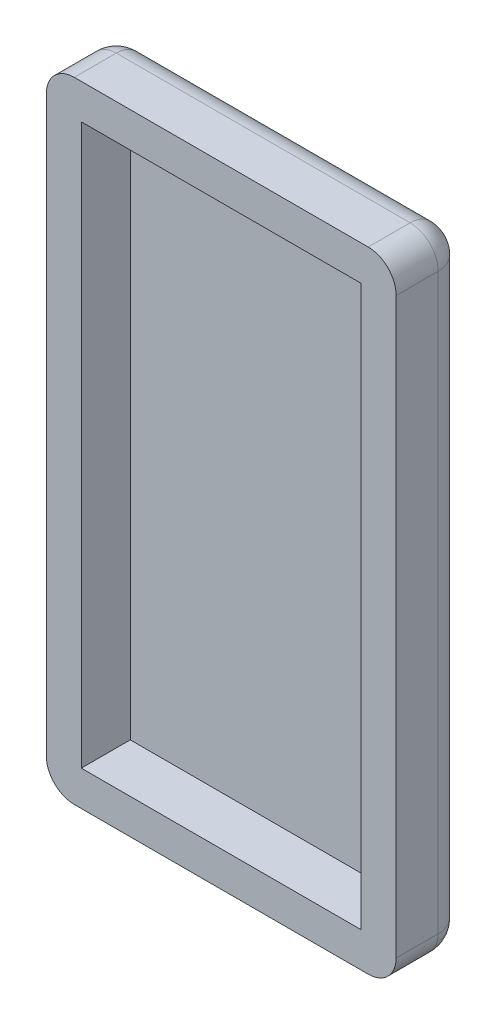
ISO-10303-21;
HEADER;
FILE_DESCRIPTION(('STEP AP214'),'2;1');
FILE_NAME('part.step','',(''),(''),'','','');
FILE_SCHEMA(('AUTOMOTIVE_DESIGN { 1 0 10303 214 1 1 1 1 }'));
ENDSEC;
DATA;
#1=APPLICATION_CONTEXT('core data for automotive mechanical design processes');
#2=APPLICATION_PROTOCOL_DEFINITION('international standard','automotive_design',2000,#1);
#3=PRODUCT_CONTEXT('',#1,'mechanical');
#4=PRODUCT('Part','Part','',(#3));
#5=PRODUCT_RELATED_PRODUCT_CATEGORY('part','',(#4));
#6=PRODUCT_DEFINITION_FORMATION('','',#4);
#7=PRODUCT_DEFINITION_CONTEXT('part definition',#1,'design');
#8=PRODUCT_DEFINITION('design','',#6,#7);
#9=PRODUCT_DEFINITION_SHAPE('','',#8);
#10=(LENGTH_UNIT() NAMED_UNIT(*) SI_UNIT(.MILLI.,.METRE.));
#11=(NAMED_UNIT(*) PLANE_ANGLE_UNIT() SI_UNIT($,.RADIAN.));
#12=(NAMED_UNIT(*) SI_UNIT($,.STERADIAN.) SOLID_ANGLE_UNIT());
#13=UNCERTAINTY_MEASURE_WITH_UNIT(LENGTH_MEASURE(1.E-05),#10,'distance_accuracy_value','');
#14=(GEOMETRIC_REPRESENTATION_CONTEXT(3) GLOBAL_UNCERTAINTY_ASSIGNED_CONTEXT((#13)) GLOBAL_UNIT_ASSIGNED_CONTEXT((#10,
#11,#12)) REPRESENTATION_CONTEXT('',''));
#15=CARTESIAN_POINT('',(0.,0.,0.));
#16=DIRECTION('',(0.,0.,1.));
#17=DIRECTION('',(1.,0.,0.));
#18=AXIS2_PLACEMENT_3D('',#15,#16,#17);
#19=CARTESIAN_POINT('',(-13.1619937694704,5.79439252336449,0.));
#20=DIRECTION('',(-1.,0.,0.));
#21=DIRECTION('',(0.,-1.,0.));
#22=AXIS2_PLACEMENT_3D('',#19,#20,#21);
#23=PLANE('',#22);
#24=DIRECTION('',(0.,-1.,0.));
#25=VECTOR('',#24,1.);
#26=CARTESIAN_POINT('',(-13.1619937694704,5.79439252336449,5.));
#27=LINE('',#26,#25);
#28=CARTESIAN_POINT('',(-13.1619937694704,3.79439252336449,5.));
#29=VERTEX_POINT('',#28);
#30=CARTESIAN_POINT('',(-13.1619937694704,-37.2056074766355,5.));
#31=VERTEX_POINT('',#30);
#32=EDGE_CURVE('E173',#29,#31,#27,.T.);
#33=ORIENTED_EDGE('',*,*,#32,.F.);
#34=DIRECTION('',(0.,0.,1.));
#35=VECTOR('',#34,1.);
#36=CARTESIAN_POINT('',(-13.1619937694704,3.79439252336449,0.));
#37=LINE('',#36,#35);
#38=CARTESIAN_POINT('',(-13.1619937694704,3.79439252336449,2.));
#39=VERTEX_POINT('',#38);
#40=EDGE_CURVE('E222',#29,#39,#37,.F.);
#41=ORIENTED_EDGE('',*,*,#40,.T.);
#42=DIRECTION('',(0.,-1.,0.));
#43=VECTOR('',#42,1.);
#44=CARTESIAN_POINT('',(-13.1619937694704,-39.2056074766355,2.));
#45=LINE('',#44,#43);
#46=CARTESIAN_POINT('',(-13.1619937694704,-37.2056074766355,2.));
#47=VERTEX_POINT('',#46);
#48=EDGE_CURVE('E218',#39,#47,#45,.T.);
#49=ORIENTED_EDGE('',*,*,#48,.T.);
#50=DIRECTION('',(0.,0.,1.));
#51=VECTOR('',#50,1.);
#52=CARTESIAN_POINT('',(-13.1619937694704,-37.2056074766355,0.));
#53=LINE('',#52,#51);
#54=EDGE_CURVE('E220',#47,#31,#53,.T.);
#55=ORIENTED_EDGE('',*,*,#54,.T.);
#56=EDGE_LOOP('',(#33,#41,#49,#55));
#57=FACE_BOUND('',#56,.T.);
#58=ADVANCED_FACE('F33',(#57),#23,.T.);
#59=CARTESIAN_POINT('',(11.8380062305296,5.79439252336449,0.));
#60=DIRECTION('',(0.,1.,0.));
#61=DIRECTION('',(0.,0.,1.));
#62=AXIS2_PLACEMENT_3D('',#59,#60,#61);
#63=PLANE('',#62);
#64=DIRECTION('',(-1.,0.,0.));
#65=VECTOR('',#64,1.);
#66=CARTESIAN_POINT('',(11.8380062305296,5.79439252336449,5.));
#67=LINE('',#66,#65);
#68=CARTESIAN_POINT('',(9.8380062305296,5.79439252336449,5.));
#69=VERTEX_POINT('',#68);
#70=CARTESIAN_POINT('',(-11.1619937694704,5.79439252336449,5.));
#71=VERTEX_POINT('',#70);
#72=EDGE_CURVE('E185',#69,#71,#67,.T.);
#73=ORIENTED_EDGE('',*,*,#72,.F.);
#74=DIRECTION('',(0.,0.,1.));
#75=VECTOR('',#74,1.);
#76=CARTESIAN_POINT('',(9.8380062305296,5.79439252336449,0.));
#77=LINE('',#76,#75);
#78=CARTESIAN_POINT('',(9.8380062305296,5.79439252336449,2.));
#79=VERTEX_POINT('',#78);
#80=EDGE_CURVE('E207',#69,#79,#77,.F.);
#81=ORIENTED_EDGE('',*,*,#80,.T.);
#82=DIRECTION('',(-1.,0.,0.));
#83=VECTOR('',#82,1.);
#84=CARTESIAN_POINT('',(-13.1619937694704,5.79439252336449,2.));
#85=LINE('',#84,#83);
#86=CARTESIAN_POINT('',(-11.1619937694704,5.79439252336449,2.));
#87=VERTEX_POINT('',#86);
#88=EDGE_CURVE('E205',#79,#87,#85,.T.);
#89=ORIENTED_EDGE('',*,*,#88,.T.);
#90=DIRECTION('',(0.,0.,1.));
#91=VECTOR('',#90,1.);
#92=CARTESIAN_POINT('',(-11.1619937694704,5.79439252336449,0.));
#93=LINE('',#92,#91);
#94=EDGE_CURVE('E203',#87,#71,#93,.T.);
#95=ORIENTED_EDGE('',*,*,#94,.T.);
#96=EDGE_LOOP('',(#73,#81,#89,#95));
#97=FACE_BOUND('',#96,.T.);
#98=ADVANCED_FACE('F315',(#97),#63,.T.);
#99=CARTESIAN_POINT('',(11.8380062305296,-39.2056074766355,0.));
#100=DIRECTION('',(1.,0.,0.));
#101=DIRECTION('',(0.,1.,0.));
#102=AXIS2_PLACEMENT_3D('',#99,#100,#101);
#103=PLANE('',#102);
#104=DIRECTION('',(0.,1.,0.));
#105=VECTOR('',#104,1.);
#106=CARTESIAN_POINT('',(11.8380062305296,5.79439252336449,2.));
#107=LINE('',#106,#105);
#108=CARTESIAN_POINT('',(11.8380062305296,-37.2056074766355,2.));
#109=VERTEX_POINT('',#108);
#110=CARTESIAN_POINT('',(11.8380062305296,3.79439252336449,2.));
#111=VERTEX_POINT('',#110);
#112=EDGE_CURVE('E190',#109,#111,#107,.T.);
#113=ORIENTED_EDGE('',*,*,#112,.T.);
#114=DIRECTION('',(0.,0.,1.));
#115=VECTOR('',#114,1.);
#116=CARTESIAN_POINT('',(11.8380062305296,3.79439252336449,0.));
#117=LINE('',#116,#115);
#118=CARTESIAN_POINT('',(11.8380062305296,3.79439252336448,5.));
#119=VERTEX_POINT('',#118);
#120=EDGE_CURVE('E192',#111,#119,#117,.T.);
#121=ORIENTED_EDGE('',*,*,#120,.T.);
#122=DIRECTION('',(0.,1.,0.));
#123=VECTOR('',#122,1.);
#124=CARTESIAN_POINT('',(11.8380062305296,-39.2056074766355,5.));
#125=LINE('',#124,#123);
#126=CARTESIAN_POINT('',(11.8380062305296,-37.2056074766355,5.));
#127=VERTEX_POINT('',#126);
#128=EDGE_CURVE('E182',#127,#119,#125,.T.);
#129=ORIENTED_EDGE('',*,*,#128,.F.);
#130=DIRECTION('',(0.,0.,1.));
#131=VECTOR('',#130,1.);
#132=CARTESIAN_POINT('',(11.8380062305296,-37.2056074766355,0.));
#133=LINE('',#132,#131);
#134=EDGE_CURVE('E188',#127,#109,#133,.F.);
#135=ORIENTED_EDGE('',*,*,#134,.T.);
#136=EDGE_LOOP('',(#113,#121,#129,#135));
#137=FACE_BOUND('',#136,.T.);
#138=ADVANCED_FACE('F307',(#137),#103,.T.);
#139=CARTESIAN_POINT('',(-13.1619937694704,-39.2056074766355,0.));
#140=DIRECTION('',(0.,-1.,0.));
#141=DIRECTION('',(0.,0.,-1.));
#142=AXIS2_PLACEMENT_3D('',#139,#140,#141);
#143=PLANE('',#142);
#144=DIRECTION('',(1.,0.,0.));
#145=VECTOR('',#144,1.);
#146=CARTESIAN_POINT('',(-13.1619937694704,-39.2056074766355,5.));
#147=LINE('',#146,#145);
#148=CARTESIAN_POINT('',(-11.1619937694704,-39.2056074766355,5.));
#149=VERTEX_POINT('',#148);
#150=CARTESIAN_POINT('',(9.83800623052961,-39.2056074766355,5.));
#151=VERTEX_POINT('',#150);
#152=EDGE_CURVE('E179',#149,#151,#147,.T.);
#153=ORIENTED_EDGE('',*,*,#152,.F.);
#154=DIRECTION('',(0.,0.,1.));
#155=VECTOR('',#154,1.);
#156=CARTESIAN_POINT('',(-11.1619937694704,-39.2056074766355,0.));
#157=LINE('',#156,#155);
#158=CARTESIAN_POINT('',(-11.1619937694704,-39.2056074766355,2.));
#159=VERTEX_POINT('',#158);
#160=EDGE_CURVE('E11',#149,#159,#157,.F.);
#161=ORIENTED_EDGE('',*,*,#160,.T.);
#162=DIRECTION('',(1.,0.,0.));
#163=VECTOR('',#162,1.);
#164=CARTESIAN_POINT('',(11.8380062305296,-39.2056074766355,2.));
#165=LINE('',#164,#163);
#166=CARTESIAN_POINT('',(9.83800623052961,-39.2056074766355,2.));
#167=VERTEX_POINT('',#166);
#168=EDGE_CURVE('E49',#159,#167,#165,.T.);
#169=ORIENTED_EDGE('',*,*,#168,.T.);
#170=DIRECTION('',(0.,0.,1.));
#171=VECTOR('',#170,1.);
#172=CARTESIAN_POINT('',(9.83800623052961,-39.2056074766355,0.));
#173=LINE('',#172,#171);
#174=EDGE_CURVE('E42',#167,#151,#173,.T.);
#175=ORIENTED_EDGE('',*,*,#174,.T.);
#176=EDGE_LOOP('',(#153,#161,#169,#175));
#177=FACE_BOUND('',#176,.T.);
#178=ADVANCED_FACE('F304',(#177),#143,.T.);
#179=CARTESIAN_POINT('',(0.,0.,0.));
#180=DIRECTION('',(0.,0.,1.));
#181=DIRECTION('',(1.,0.,0.));
#182=AXIS2_PLACEMENT_3D('',#179,#180,#181);
#183=PLANE('',#182);
#184=DIRECTION('',(0.,-1.,0.));
#185=VECTOR('',#184,1.);
#186=CARTESIAN_POINT('',(-11.1619937694704,5.79439252336449,0.));
#187=LINE('',#186,#185);
#188=CARTESIAN_POINT('',(-11.1619937694704,-37.2056074766355,0.));
#189=VERTEX_POINT('',#188);
#190=CARTESIAN_POINT('',(-11.1619937694704,3.79439252336449,0.));
#191=VERTEX_POINT('',#190);
#192=EDGE_CURVE('E211',#189,#191,#187,.F.);
#193=ORIENTED_EDGE('',*,*,#192,.T.);
#194=DIRECTION('',(-1.,0.,0.));
#195=VECTOR('',#194,1.);
#196=CARTESIAN_POINT('',(11.8380062305296,3.79439252336449,0.));
#197=LINE('',#196,#195);
#198=CARTESIAN_POINT('',(9.8380062305296,3.79439252336449,0.));
#199=VERTEX_POINT('',#198);
#200=EDGE_CURVE('E215',#191,#199,#197,.F.);
#201=ORIENTED_EDGE('',*,*,#200,.T.);
#202=DIRECTION('',(0.,1.,0.));
#203=VECTOR('',#202,1.);
#204=CARTESIAN_POINT('',(9.83800623052961,-39.2056074766355,0.));
#205=LINE('',#204,#203);
#206=CARTESIAN_POINT('',(9.83800623052961,-37.2056074766355,0.));
#207=VERTEX_POINT('',#206);
#208=EDGE_CURVE('E213',#199,#207,#205,.F.);
#209=ORIENTED_EDGE('',*,*,#208,.T.);
#210=DIRECTION('',(1.,0.,0.));
#211=VECTOR('',#210,1.);
#212=CARTESIAN_POINT('',(-13.1619937694704,-37.2056074766355,0.));
#213=LINE('',#212,#211);
#214=EDGE_CURVE('E209',#207,#189,#213,.F.);
#215=ORIENTED_EDGE('',*,*,#214,.T.);
#216=EDGE_LOOP('',(#193,#201,#209,#215));
#217=FACE_BOUND('',#216,.T.);
#218=ADVANCED_FACE('F290',(#217),#183,.F.);
#219=CARTESIAN_POINT('',(0.,0.,5.));
#220=DIRECTION('',(0.,0.,1.));
#221=DIRECTION('',(1.,0.,0.));
#222=AXIS2_PLACEMENT_3D('',#219,#220,#221);
#223=PLANE('',#222);
#224=DIRECTION('',(0.,1.,0.));
#225=VECTOR('',#224,1.);
#226=CARTESIAN_POINT('',(9.3380062305296,-36.7056074766355,5.));
#227=LINE('',#226,#225);
#228=CARTESIAN_POINT('',(9.3380062305296,-36.7056074766355,5.));
#229=VERTEX_POINT('',#228);
#230=CARTESIAN_POINT('',(9.33800623052959,3.29439252336449,5.));
#231=VERTEX_POINT('',#230);
#232=EDGE_CURVE('E141',#229,#231,#227,.T.);
#233=ORIENTED_EDGE('',*,*,#232,.F.);
#234=DIRECTION('',(1.,0.,0.));
#235=VECTOR('',#234,1.);
#236=CARTESIAN_POINT('',(-10.6619937694704,-36.7056074766355,5.));
#237=LINE('',#236,#235);
#238=CARTESIAN_POINT('',(-10.6619937694704,-36.7056074766355,5.));
#239=VERTEX_POINT('',#238);
#240=EDGE_CURVE('E158',#239,#229,#237,.T.);
#241=ORIENTED_EDGE('',*,*,#240,.F.);
#242=DIRECTION('',(0.,-1.,0.));
#243=VECTOR('',#242,1.);
#244=CARTESIAN_POINT('',(-10.6619937694704,3.29439252336449,5.));
#245=LINE('',#244,#243);
#246=CARTESIAN_POINT('',(-10.6619937694704,3.29439252336449,5.));
#247=VERTEX_POINT('',#246);
#248=EDGE_CURVE('E161',#247,#239,#245,.T.);
#249=ORIENTED_EDGE('',*,*,#248,.F.);
#250=DIRECTION('',(-1.,0.,0.));
#251=VECTOR('',#250,1.);
#252=CARTESIAN_POINT('',(9.33800623052959,3.29439252336449,5.));
#253=LINE('',#252,#251);
#254=EDGE_CURVE('E167',#231,#247,#253,.T.);
#255=ORIENTED_EDGE('',*,*,#254,.F.);
#256=EDGE_LOOP('',(#233,#241,#249,#255));
#257=FACE_BOUND('',#256,.T.);
#258=ORIENTED_EDGE('',*,*,#128,.T.);
#259=CARTESIAN_POINT('',(9.8380062305296,3.79439252336449,5.));
#260=DIRECTION('',(0.,0.,1.));
#261=DIRECTION('',(1.,0.,0.));
#262=AXIS2_PLACEMENT_3D('',#259,#260,#261);
#263=CIRCLE('',#262,2.);
#264=EDGE_CURVE('E201',#119,#69,#263,.T.);
#265=ORIENTED_EDGE('',*,*,#264,.T.);
#266=ORIENTED_EDGE('',*,*,#72,.T.);
#267=CARTESIAN_POINT('',(-11.1619937694704,3.79439252336449,5.));
#268=DIRECTION('',(0.,0.,1.));
#269=DIRECTION('',(1.,0.,0.));
#270=AXIS2_PLACEMENT_3D('',#267,#268,#269);
#271=CIRCLE('',#270,2.);
#272=EDGE_CURVE('E199',#71,#29,#271,.T.);
#273=ORIENTED_EDGE('',*,*,#272,.T.);
#274=ORIENTED_EDGE('',*,*,#32,.T.);
#275=CARTESIAN_POINT('',(-11.1619937694704,-37.2056074766355,5.));
#276=DIRECTION('',(0.,0.,1.));
#277=DIRECTION('',(1.,0.,0.));
#278=AXIS2_PLACEMENT_3D('',#275,#276,#277);
#279=CIRCLE('',#278,2.);
#280=EDGE_CURVE('E197',#31,#149,#279,.T.);
#281=ORIENTED_EDGE('',*,*,#280,.T.);
#282=ORIENTED_EDGE('',*,*,#152,.T.);
#283=CARTESIAN_POINT('',(9.83800623052961,-37.2056074766355,5.));
#284=DIRECTION('',(0.,0.,1.));
#285=DIRECTION('',(1.,0.,0.));
#286=AXIS2_PLACEMENT_3D('',#283,#284,#285);
#287=CIRCLE('',#286,2.);
#288=EDGE_CURVE('E195',#151,#127,#287,.T.);
#289=ORIENTED_EDGE('',*,*,#288,.T.);
#290=EDGE_LOOP('',(#258,#265,#266,#273,#274,#281,#282,#289));
#291=FACE_BOUND('',#290,.T.);
#292=ADVANCED_FACE('F271',(#257,#291),#223,.T.);
#293=CARTESIAN_POINT('',(9.3380062305296,-36.7056074766355,1.5));
#294=DIRECTION('',(1.,0.,0.));
#295=DIRECTION('',(0.,1.,0.));
#296=AXIS2_PLACEMENT_3D('',#293,#294,#295);
#297=PLANE('',#296);
#298=ORIENTED_EDGE('',*,*,#232,.T.);
#299=DIRECTION('',(0.,0.,1.));
#300=VECTOR('',#299,1.);
#301=CARTESIAN_POINT('',(9.33800623052959,3.29439252336449,1.5));
#302=LINE('',#301,#300);
#303=CARTESIAN_POINT('',(9.33800623052959,3.29439252336449,1.5));
#304=VERTEX_POINT('',#303);
#305=EDGE_CURVE('E134',#304,#231,#302,.T.);
#306=ORIENTED_EDGE('',*,*,#305,.F.);
#307=DIRECTION('',(0.,1.,0.));
#308=VECTOR('',#307,1.);
#309=CARTESIAN_POINT('',(9.3380062305296,-36.7056074766355,1.5));
#310=LINE('',#309,#308);
#311=CARTESIAN_POINT('',(9.3380062305296,-36.7056074766355,1.5));
#312=VERTEX_POINT('',#311);
#313=EDGE_CURVE('E138',#312,#304,#310,.T.);
#314=ORIENTED_EDGE('',*,*,#313,.F.);
#315=DIRECTION('',(0.,0.,1.));
#316=VECTOR('',#315,1.);
#317=CARTESIAN_POINT('',(9.3380062305296,-36.7056074766355,1.5));
#318=LINE('',#317,#316);
#319=EDGE_CURVE('E171',#312,#229,#318,.T.);
#320=ORIENTED_EDGE('',*,*,#319,.T.);
#321=EDGE_LOOP('',(#298,#306,#314,#320));
#322=FACE_BOUND('',#321,.T.);
#323=ADVANCED_FACE('F136',(#322),#297,.F.);
#324=CARTESIAN_POINT('',(-10.6619937694704,-36.7056074766355,1.5));
#325=DIRECTION('',(0.,-1.,0.));
#326=DIRECTION('',(0.,0.,-1.));
#327=AXIS2_PLACEMENT_3D('',#324,#325,#326);
#328=PLANE('',#327);
#329=ORIENTED_EDGE('',*,*,#240,.T.);
#330=ORIENTED_EDGE('',*,*,#319,.F.);
#331=DIRECTION('',(1.,0.,0.));
#332=VECTOR('',#331,1.);
#333=CARTESIAN_POINT('',(-10.6619937694704,-36.7056074766355,1.5));
#334=LINE('',#333,#332);
#335=CARTESIAN_POINT('',(-10.6619937694704,-36.7056074766355,1.5));
#336=VERTEX_POINT('',#335);
#337=EDGE_CURVE('E146',#336,#312,#334,.T.);
#338=ORIENTED_EDGE('',*,*,#337,.F.);
#339=DIRECTION('',(0.,0.,1.));
#340=VECTOR('',#339,1.);
#341=CARTESIAN_POINT('',(-10.6619937694704,-36.7056074766355,1.5));
#342=LINE('',#341,#340);
#343=EDGE_CURVE('E174',#336,#239,#342,.T.);
#344=ORIENTED_EDGE('',*,*,#343,.T.);
#345=EDGE_LOOP('',(#329,#330,#338,#344));
#346=FACE_BOUND('',#345,.T.);
#347=ADVANCED_FACE('F485',(#346),#328,.F.);
#348=CARTESIAN_POINT('',(-10.6619937694704,3.29439252336449,1.5));
#349=DIRECTION('',(-1.,0.,0.));
#350=DIRECTION('',(0.,0.,1.));
#351=AXIS2_PLACEMENT_3D('',#348,#349,#350);
#352=PLANE('',#351);
#353=ORIENTED_EDGE('',*,*,#248,.T.);
#354=ORIENTED_EDGE('',*,*,#343,.F.);
#355=DIRECTION('',(0.,-1.,0.));
#356=VECTOR('',#355,1.);
#357=CARTESIAN_POINT('',(-10.6619937694704,3.29439252336449,1.5));
#358=LINE('',#357,#356);
#359=CARTESIAN_POINT('',(-10.6619937694704,3.29439252336449,1.5));
#360=VERTEX_POINT('',#359);
#361=EDGE_CURVE('E154',#360,#336,#358,.T.);
#362=ORIENTED_EDGE('',*,*,#361,.F.);
#363=DIRECTION('',(0.,0.,1.));
#364=VECTOR('',#363,1.);
#365=CARTESIAN_POINT('',(-10.6619937694704,3.29439252336449,1.5));
#366=LINE('',#365,#364);
#367=EDGE_CURVE('E145',#360,#247,#366,.T.);
#368=ORIENTED_EDGE('',*,*,#367,.T.);
#369=EDGE_LOOP('',(#353,#354,#362,#368));
#370=FACE_BOUND('',#369,.T.);
#371=ADVANCED_FACE('F476',(#370),#352,.F.);
#372=CARTESIAN_POINT('',(9.33800623052959,3.29439252336449,1.5));
#373=DIRECTION('',(0.,1.,0.));
#374=DIRECTION('',(0.,0.,1.));
#375=AXIS2_PLACEMENT_3D('',#372,#373,#374);
#376=PLANE('',#375);
#377=ORIENTED_EDGE('',*,*,#254,.T.);
#378=ORIENTED_EDGE('',*,*,#367,.F.);
#379=DIRECTION('',(-1.,0.,0.));
#380=VECTOR('',#379,1.);
#381=CARTESIAN_POINT('',(9.33800623052959,3.29439252336449,1.5));
#382=LINE('',#381,#380);
#383=EDGE_CURVE('E149',#304,#360,#382,.T.);
#384=ORIENTED_EDGE('',*,*,#383,.F.);
#385=ORIENTED_EDGE('',*,*,#305,.T.);
#386=EDGE_LOOP('',(#377,#378,#384,#385));
#387=FACE_BOUND('',#386,.T.);
#388=ADVANCED_FACE('F150',(#387),#376,.F.);
#389=CARTESIAN_POINT('',(0.,0.,1.5));
#390=DIRECTION('',(0.,0.,1.));
#391=DIRECTION('',(1.,0.,0.));
#392=AXIS2_PLACEMENT_3D('',#389,#390,#391);
#393=PLANE('',#392);
#394=ORIENTED_EDGE('',*,*,#313,.T.);
#395=ORIENTED_EDGE('',*,*,#383,.T.);
#396=ORIENTED_EDGE('',*,*,#361,.T.);
#397=ORIENTED_EDGE('',*,*,#337,.T.);
#398=EDGE_LOOP('',(#394,#395,#396,#397));
#399=FACE_BOUND('',#398,.T.);
#400=ADVANCED_FACE('F156',(#399),#393,.T.);
#401=CARTESIAN_POINT('',(-11.1619937694704,-37.2056074766355,0.));
#402=DIRECTION('',(0.,0.,1.));
#403=DIRECTION('',(1.,0.,0.));
#404=AXIS2_PLACEMENT_3D('',#401,#402,#403);
#405=CYLINDRICAL_SURFACE('',#404,2.);
#406=CARTESIAN_POINT('',(-11.1619937694704,-37.2056074766355,2.));
#407=DIRECTION('',(0.,0.,-1.));
#408=DIRECTION('',(-1.,0.,0.));
#409=AXIS2_PLACEMENT_3D('',#406,#407,#408);
#410=CIRCLE('',#409,2.);
#411=EDGE_CURVE('E37',#159,#47,#410,.T.);
#412=ORIENTED_EDGE('',*,*,#411,.F.);
#413=ORIENTED_EDGE('',*,*,#160,.F.);
#414=ORIENTED_EDGE('',*,*,#280,.F.);
#415=ORIENTED_EDGE('',*,*,#54,.F.);
#416=EDGE_LOOP('',(#412,#413,#414,#415));
#417=FACE_BOUND('',#416,.T.);
#418=ADVANCED_FACE('F35',(#417),#405,.T.);
#419=CARTESIAN_POINT('',(-11.1619937694704,-37.2056074766355,2.));
#420=DIRECTION('',(-1.,0.,0.));
#421=DIRECTION('',(0.,0.,1.));
#422=AXIS2_PLACEMENT_3D('',#419,#420,#421);
#423=SPHERICAL_SURFACE('',#422,2.);
#424=CARTESIAN_POINT('',(-11.1619937694704,-37.2056074766355,2.));
#425=DIRECTION('',(-1.,0.,0.));
#426=DIRECTION('',(0.,0.,1.));
#427=AXIS2_PLACEMENT_3D('',#424,#425,#426);
#428=CIRCLE('',#427,2.);
#429=EDGE_CURVE('E252',#159,#189,#428,.F.);
#430=ORIENTED_EDGE('',*,*,#429,.F.);
#431=ORIENTED_EDGE('',*,*,#411,.T.);
#432=CARTESIAN_POINT('',(-11.1619937694704,-37.2056074766355,2.));
#433=DIRECTION('',(0.,-1.,0.));
#434=DIRECTION('',(0.,0.,-1.));
#435=AXIS2_PLACEMENT_3D('',#432,#433,#434);
#436=CIRCLE('',#435,2.);
#437=EDGE_CURVE('E254',#189,#47,#436,.F.);
#438=ORIENTED_EDGE('',*,*,#437,.F.);
#439=EDGE_LOOP('',(#430,#431,#438));
#440=FACE_BOUND('',#439,.T.);
#441=ADVANCED_FACE('F263',(#440),#423,.T.);
#442=CARTESIAN_POINT('',(-11.1619937694704,3.79439252336449,0.));
#443=DIRECTION('',(0.,0.,1.));
#444=DIRECTION('',(1.,0.,0.));
#445=AXIS2_PLACEMENT_3D('',#442,#443,#444);
#446=CYLINDRICAL_SURFACE('',#445,2.);
#447=ORIENTED_EDGE('',*,*,#272,.F.);
#448=ORIENTED_EDGE('',*,*,#94,.F.);
#449=CARTESIAN_POINT('',(-11.1619937694704,3.79439252336449,2.));
#450=DIRECTION('',(0.,0.,-1.));
#451=DIRECTION('',(-1.,0.,0.));
#452=AXIS2_PLACEMENT_3D('',#449,#450,#451);
#453=CIRCLE('',#452,2.);
#454=EDGE_CURVE('E249',#39,#87,#453,.T.);
#455=ORIENTED_EDGE('',*,*,#454,.F.);
#456=ORIENTED_EDGE('',*,*,#40,.F.);
#457=EDGE_LOOP('',(#447,#448,#455,#456));
#458=FACE_BOUND('',#457,.T.);
#459=ADVANCED_FACE('F276',(#458),#446,.T.);
#460=CARTESIAN_POINT('',(-11.1619937694704,5.79439252336449,2.));
#461=DIRECTION('',(0.,1.,0.));
#462=DIRECTION('',(-1.,0.,0.));
#463=AXIS2_PLACEMENT_3D('',#460,#461,#462);
#464=CYLINDRICAL_SURFACE('',#463,2.);
#465=ORIENTED_EDGE('',*,*,#437,.T.);
#466=ORIENTED_EDGE('',*,*,#48,.F.);
#467=CARTESIAN_POINT('',(-11.1619937694704,3.79439252336449,2.));
#468=DIRECTION('',(0.,1.,0.));
#469=DIRECTION('',(-1.,0.,0.));
#470=AXIS2_PLACEMENT_3D('',#467,#468,#469);
#471=CIRCLE('',#470,2.);
#472=EDGE_CURVE('E246',#191,#39,#471,.T.);
#473=ORIENTED_EDGE('',*,*,#472,.F.);
#474=ORIENTED_EDGE('',*,*,#192,.F.);
#475=EDGE_LOOP('',(#465,#466,#473,#474));
#476=FACE_BOUND('',#475,.T.);
#477=ADVANCED_FACE('F279',(#476),#464,.T.);
#478=CARTESIAN_POINT('',(-13.1619937694704,-37.2056074766355,2.));
#479=DIRECTION('',(-1.,0.,0.));
#480=DIRECTION('',(0.,0.,1.));
#481=AXIS2_PLACEMENT_3D('',#478,#479,#480);
#482=CYLINDRICAL_SURFACE('',#481,2.);
#483=ORIENTED_EDGE('',*,*,#429,.T.);
#484=ORIENTED_EDGE('',*,*,#214,.F.);
#485=CARTESIAN_POINT('',(9.83800623052961,-37.2056074766355,2.));
#486=DIRECTION('',(1.,0.,0.));
#487=DIRECTION('',(0.,0.,-1.));
#488=AXIS2_PLACEMENT_3D('',#485,#486,#487);
#489=CIRCLE('',#488,2.);
#490=EDGE_CURVE('E243',#167,#207,#489,.T.);
#491=ORIENTED_EDGE('',*,*,#490,.F.);
#492=ORIENTED_EDGE('',*,*,#168,.F.);
#493=EDGE_LOOP('',(#483,#484,#491,#492));
#494=FACE_BOUND('',#493,.T.);
#495=ADVANCED_FACE('F294',(#494),#482,.T.);
#496=CARTESIAN_POINT('',(9.83800623052961,-37.2056074766355,0.));
#497=DIRECTION('',(0.,0.,1.));
#498=DIRECTION('',(1.,0.,0.));
#499=AXIS2_PLACEMENT_3D('',#496,#497,#498);
#500=CYLINDRICAL_SURFACE('',#499,2.);
#501=ORIENTED_EDGE('',*,*,#288,.F.);
#502=ORIENTED_EDGE('',*,*,#174,.F.);
#503=CARTESIAN_POINT('',(9.83800623052961,-37.2056074766355,2.));
#504=DIRECTION('',(0.,0.,-1.));
#505=DIRECTION('',(-1.,0.,0.));
#506=AXIS2_PLACEMENT_3D('',#503,#504,#505);
#507=CIRCLE('',#506,2.);
#508=EDGE_CURVE('E240',#109,#167,#507,.T.);
#509=ORIENTED_EDGE('',*,*,#508,.F.);
#510=ORIENTED_EDGE('',*,*,#134,.F.);
#511=EDGE_LOOP('',(#501,#502,#509,#510));
#512=FACE_BOUND('',#511,.T.);
#513=ADVANCED_FACE('F303',(#512),#500,.T.);
#514=CARTESIAN_POINT('',(-11.1619937694704,3.79439252336449,2.));
#515=DIRECTION('',(-1.,0.,0.));
#516=DIRECTION('',(0.,-1.,0.));
#517=AXIS2_PLACEMENT_3D('',#514,#515,#516);
#518=SPHERICAL_SURFACE('',#517,2.);
#519=ORIENTED_EDGE('',*,*,#472,.T.);
#520=ORIENTED_EDGE('',*,*,#454,.T.);
#521=CARTESIAN_POINT('',(-11.1619937694704,3.79439252336449,2.));
#522=DIRECTION('',(-1.,0.,0.));
#523=DIRECTION('',(0.,0.,1.));
#524=AXIS2_PLACEMENT_3D('',#521,#522,#523);
#525=CIRCLE('',#524,2.);
#526=EDGE_CURVE('E237',#191,#87,#525,.F.);
#527=ORIENTED_EDGE('',*,*,#526,.F.);
#528=EDGE_LOOP('',(#519,#520,#527));
#529=FACE_BOUND('',#528,.T.);
#530=ADVANCED_FACE('F283',(#529),#518,.T.);
#531=CARTESIAN_POINT('',(9.83800623052961,-37.2056074766355,2.));
#532=DIRECTION('',(0.,-1.,0.));
#533=DIRECTION('',(0.,0.,-1.));
#534=AXIS2_PLACEMENT_3D('',#531,#532,#533);
#535=SPHERICAL_SURFACE('',#534,2.);
#536=ORIENTED_EDGE('',*,*,#508,.T.);
#537=ORIENTED_EDGE('',*,*,#490,.T.);
#538=CARTESIAN_POINT('',(9.83800623052961,-37.2056074766355,2.));
#539=DIRECTION('',(0.,-1.,0.));
#540=DIRECTION('',(0.,0.,-1.));
#541=AXIS2_PLACEMENT_3D('',#538,#539,#540);
#542=CIRCLE('',#541,2.);
#543=EDGE_CURVE('E234',#109,#207,#542,.F.);
#544=ORIENTED_EDGE('',*,*,#543,.F.);
#545=EDGE_LOOP('',(#536,#537,#544));
#546=FACE_BOUND('',#545,.T.);
#547=ADVANCED_FACE('F298',(#546),#535,.T.);
#548=CARTESIAN_POINT('',(11.8380062305296,3.79439252336449,2.));
#549=DIRECTION('',(1.,0.,0.));
#550=DIRECTION('',(0.,0.,-1.));
#551=AXIS2_PLACEMENT_3D('',#548,#549,#550);
#552=CYLINDRICAL_SURFACE('',#551,2.);
#553=ORIENTED_EDGE('',*,*,#526,.T.);
#554=ORIENTED_EDGE('',*,*,#88,.F.);
#555=CARTESIAN_POINT('',(9.8380062305296,3.79439252336449,2.));
#556=DIRECTION('',(1.,0.,0.));
#557=DIRECTION('',(0.,0.,-1.));
#558=AXIS2_PLACEMENT_3D('',#555,#556,#557);
#559=CIRCLE('',#558,2.);
#560=EDGE_CURVE('E231',#199,#79,#559,.T.);
#561=ORIENTED_EDGE('',*,*,#560,.F.);
#562=ORIENTED_EDGE('',*,*,#200,.F.);
#563=EDGE_LOOP('',(#553,#554,#561,#562));
#564=FACE_BOUND('',#563,.T.);
#565=ADVANCED_FACE('F287',(#564),#552,.T.);
#566=CARTESIAN_POINT('',(9.83800623052961,-39.2056074766355,2.));
#567=DIRECTION('',(0.,-1.,0.));
#568=DIRECTION('',(1.,0.,0.));
#569=AXIS2_PLACEMENT_3D('',#566,#567,#568);
#570=CYLINDRICAL_SURFACE('',#569,2.);
#571=ORIENTED_EDGE('',*,*,#543,.T.);
#572=ORIENTED_EDGE('',*,*,#208,.F.);
#573=CARTESIAN_POINT('',(9.8380062305296,3.79439252336449,2.));
#574=DIRECTION('',(0.,1.,0.));
#575=DIRECTION('',(0.,0.,1.));
#576=AXIS2_PLACEMENT_3D('',#573,#574,#575);
#577=CIRCLE('',#576,2.);
#578=EDGE_CURVE('E229',#111,#199,#577,.T.);
#579=ORIENTED_EDGE('',*,*,#578,.F.);
#580=ORIENTED_EDGE('',*,*,#112,.F.);
#581=EDGE_LOOP('',(#571,#572,#579,#580));
#582=FACE_BOUND('',#581,.T.);
#583=ADVANCED_FACE('F319',(#582),#570,.T.);
#584=CARTESIAN_POINT('',(9.8380062305296,3.79439252336449,2.));
#585=DIRECTION('',(0.,0.,-1.));
#586=DIRECTION('',(-1.,0.,0.));
#587=AXIS2_PLACEMENT_3D('',#584,#585,#586);
#588=SPHERICAL_SURFACE('',#587,2.);
#589=ORIENTED_EDGE('',*,*,#578,.T.);
#590=ORIENTED_EDGE('',*,*,#560,.T.);
#591=CARTESIAN_POINT('',(9.8380062305296,3.79439252336449,2.));
#592=DIRECTION('',(0.,0.,-1.));
#593=DIRECTION('',(-1.,0.,0.));
#594=AXIS2_PLACEMENT_3D('',#591,#592,#593);
#595=CIRCLE('',#594,2.);
#596=EDGE_CURVE('E226',#111,#79,#595,.F.);
#597=ORIENTED_EDGE('',*,*,#596,.F.);
#598=EDGE_LOOP('',(#589,#590,#597));
#599=FACE_BOUND('',#598,.T.);
#600=ADVANCED_FACE('F317',(#599),#588,.T.);
#601=CARTESIAN_POINT('',(9.8380062305296,3.79439252336449,0.));
#602=DIRECTION('',(0.,0.,1.));
#603=DIRECTION('',(1.,0.,0.));
#604=AXIS2_PLACEMENT_3D('',#601,#602,#603);
#605=CYLINDRICAL_SURFACE('',#604,2.);
#606=ORIENTED_EDGE('',*,*,#596,.T.);
#607=ORIENTED_EDGE('',*,*,#80,.F.);
#608=ORIENTED_EDGE('',*,*,#264,.F.);
#609=ORIENTED_EDGE('',*,*,#120,.F.);
#610=EDGE_LOOP('',(#606,#607,#608,#609));
#611=FACE_BOUND('',#610,.T.);
#612=ADVANCED_FACE('F311',(#611),#605,.T.);
#613=CLOSED_SHELL('',(#58,#98,#138,#178,#218,#292,#323,#347,#371,#388,#400,#418,#441,#459,#477,
#495,#513,#530,#547,#565,#583,#600,#612));
#614=MANIFOLD_SOLID_BREP('B2',#613);
#615=ADVANCED_BREP_SHAPE_REPRESENTATION('',(#18,#614),#14);
#616=SHAPE_DEFINITION_REPRESENTATION(#9,#615);
ENDSEC;
END-ISO-10303-21;
